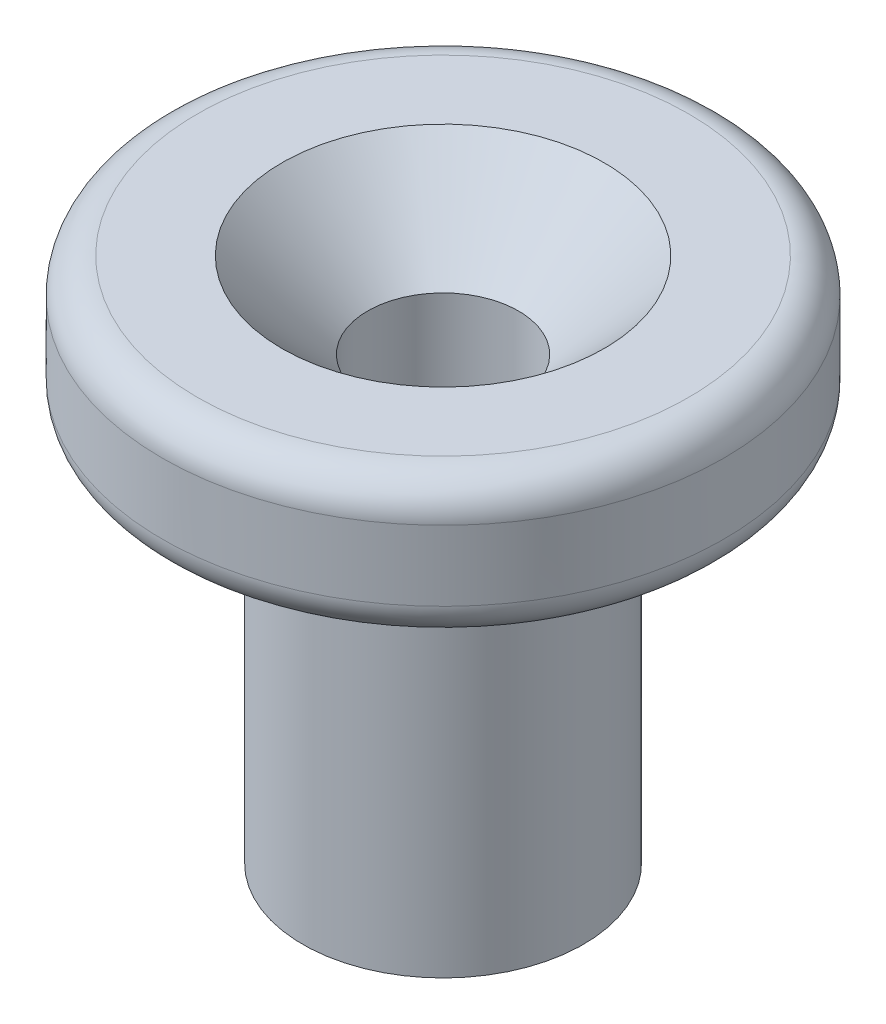
ISO-10303-21;
HEADER;
FILE_DESCRIPTION(('STEP AP214'),'2;1');
FILE_NAME('part.step','',(''),(''),'','','');
FILE_SCHEMA(('AUTOMOTIVE_DESIGN { 1 0 10303 214 1 1 1 1 }'));
ENDSEC;
DATA;
#1=APPLICATION_CONTEXT('core data for automotive mechanical design processes');
#2=APPLICATION_PROTOCOL_DEFINITION('international standard','automotive_design',2000,#1);
#3=PRODUCT_CONTEXT('',#1,'mechanical');
#4=PRODUCT('Part','Part','',(#3));
#5=PRODUCT_RELATED_PRODUCT_CATEGORY('part','',(#4));
#6=PRODUCT_DEFINITION_FORMATION('','',#4);
#7=PRODUCT_DEFINITION_CONTEXT('part definition',#1,'design');
#8=PRODUCT_DEFINITION('design','',#6,#7);
#9=PRODUCT_DEFINITION_SHAPE('','',#8);
#10=(LENGTH_UNIT() NAMED_UNIT(*) SI_UNIT(.MILLI.,.METRE.));
#11=(NAMED_UNIT(*) PLANE_ANGLE_UNIT() SI_UNIT($,.RADIAN.));
#12=(NAMED_UNIT(*) SI_UNIT($,.STERADIAN.) SOLID_ANGLE_UNIT());
#13=UNCERTAINTY_MEASURE_WITH_UNIT(LENGTH_MEASURE(1.E-05),#10,'distance_accuracy_value','');
#14=(GEOMETRIC_REPRESENTATION_CONTEXT(3) GLOBAL_UNCERTAINTY_ASSIGNED_CONTEXT((#13)) GLOBAL_UNIT_ASSIGNED_CONTEXT((#10,
#11,#12)) REPRESENTATION_CONTEXT('',''));
#15=CARTESIAN_POINT('',(0.,0.,0.));
#16=DIRECTION('',(0.,0.,1.));
#17=DIRECTION('',(1.,0.,0.));
#18=AXIS2_PLACEMENT_3D('',#15,#16,#17);
#19=CARTESIAN_POINT('',(0.,15.,0.));
#20=DIRECTION('',(0.,1.,0.));
#21=DIRECTION('',(0.,0.,1.));
#22=AXIS2_PLACEMENT_3D('',#19,#20,#21);
#23=PLANE('',#22);
#24=CARTESIAN_POINT('',(0.,15.,0.));
#25=DIRECTION('',(0.,1.,0.));
#26=DIRECTION('',(0.,0.,1.));
#27=AXIS2_PLACEMENT_3D('',#24,#25,#26);
#28=CIRCLE('',#27,4.59);
#29=CARTESIAN_POINT('',(0.,15.,4.59));
#30=VERTEX_POINT('',#29);
#31=EDGE_CURVE('E67',#30,#30,#28,.T.);
#32=ORIENTED_EDGE('',*,*,#31,.F.);
#33=EDGE_LOOP('',(#32));
#34=FACE_BOUND('',#33,.T.);
#35=CARTESIAN_POINT('',(0.,15.,0.));
#36=DIRECTION('',(0.,1.,0.));
#37=DIRECTION('',(0.,0.,1.));
#38=AXIS2_PLACEMENT_3D('',#35,#36,#37);
#39=CIRCLE('',#38,7.);
#40=CARTESIAN_POINT('',(0.,15.,7.));
#41=VERTEX_POINT('',#40);
#42=EDGE_CURVE('E39',#41,#41,#39,.T.);
#43=ORIENTED_EDGE('',*,*,#42,.T.);
#44=EDGE_LOOP('',(#43));
#45=FACE_BOUND('',#44,.T.);
#46=ADVANCED_FACE('F32',(#34,#45),#23,.T.);
#47=CARTESIAN_POINT('',(0.,0.,0.));
#48=DIRECTION('',(0.,-1.,0.));
#49=DIRECTION('',(0.,0.,-1.));
#50=AXIS2_PLACEMENT_3D('',#47,#48,#49);
#51=CYLINDRICAL_SURFACE('',#50,8.);
#52=CARTESIAN_POINT('',(0.,12.,0.));
#53=DIRECTION('',(0.,-1.,0.));
#54=DIRECTION('',(0.,0.,-1.));
#55=AXIS2_PLACEMENT_3D('',#52,#53,#54);
#56=CIRCLE('',#55,8.);
#57=CARTESIAN_POINT('',(0.,12.,-8.));
#58=VERTEX_POINT('',#57);
#59=EDGE_CURVE('E43',#58,#58,#56,.F.);
#60=ORIENTED_EDGE('',*,*,#59,.T.);
#61=EDGE_LOOP('',(#60));
#62=FACE_BOUND('',#61,.T.);
#63=CARTESIAN_POINT('',(0.,14.,0.));
#64=DIRECTION('',(0.,1.,0.));
#65=DIRECTION('',(0.,0.,1.));
#66=AXIS2_PLACEMENT_3D('',#63,#64,#65);
#67=CIRCLE('',#66,8.);
#68=CARTESIAN_POINT('',(0.,14.,8.));
#69=VERTEX_POINT('',#68);
#70=EDGE_CURVE('E47',#69,#69,#67,.F.);
#71=ORIENTED_EDGE('',*,*,#70,.T.);
#72=EDGE_LOOP('',(#71));
#73=FACE_BOUND('',#72,.T.);
#74=ADVANCED_FACE('F74',(#62,#73),#51,.T.);
#75=CARTESIAN_POINT('',(8.,11.,0.));
#76=DIRECTION('',(0.,-1.,0.));
#77=DIRECTION('',(0.,0.,-1.));
#78=AXIS2_PLACEMENT_3D('',#75,#76,#77);
#79=PLANE('',#78);
#80=CARTESIAN_POINT('',(0.,11.,0.));
#81=DIRECTION('',(0.,-1.,0.));
#82=DIRECTION('',(0.,0.,-1.));
#83=AXIS2_PLACEMENT_3D('',#80,#81,#82);
#84=CIRCLE('',#83,7.);
#85=CARTESIAN_POINT('',(0.,11.,-7.));
#86=VERTEX_POINT('',#85);
#87=EDGE_CURVE('E52',#86,#86,#84,.T.);
#88=ORIENTED_EDGE('',*,*,#87,.T.);
#89=EDGE_LOOP('',(#88));
#90=FACE_BOUND('',#89,.T.);
#91=CARTESIAN_POINT('',(0.,11.,0.));
#92=DIRECTION('',(0.,-1.,0.));
#93=DIRECTION('',(0.,0.,-1.));
#94=AXIS2_PLACEMENT_3D('',#91,#92,#93);
#95=CIRCLE('',#94,5.);
#96=CARTESIAN_POINT('',(0.,11.,-5.));
#97=VERTEX_POINT('',#96);
#98=EDGE_CURVE('E55',#97,#97,#95,.F.);
#99=ORIENTED_EDGE('',*,*,#98,.T.);
#100=EDGE_LOOP('',(#99));
#101=FACE_BOUND('',#100,.T.);
#102=ADVANCED_FACE('F79',(#90,#101),#79,.T.);
#103=CARTESIAN_POINT('',(0.,0.,0.));
#104=DIRECTION('',(0.,-1.,0.));
#105=DIRECTION('',(0.,0.,-1.));
#106=AXIS2_PLACEMENT_3D('',#103,#104,#105);
#107=CYLINDRICAL_SURFACE('',#106,4.);
#108=CARTESIAN_POINT('',(0.,10.,0.));
#109=DIRECTION('',(0.,-1.,0.));
#110=DIRECTION('',(0.,0.,-1.));
#111=AXIS2_PLACEMENT_3D('',#108,#109,#110);
#112=CIRCLE('',#111,4.);
#113=CARTESIAN_POINT('',(0.,10.,-4.));
#114=VERTEX_POINT('',#113);
#115=EDGE_CURVE('E10',#114,#114,#112,.T.);
#116=ORIENTED_EDGE('',*,*,#115,.T.);
#117=EDGE_LOOP('',(#116));
#118=FACE_BOUND('',#117,.T.);
#119=CARTESIAN_POINT('',(0.,0.,0.));
#120=DIRECTION('',(0.,-1.,0.));
#121=DIRECTION('',(0.,0.,-1.));
#122=AXIS2_PLACEMENT_3D('',#119,#120,#121);
#123=CIRCLE('',#122,4.);
#124=CARTESIAN_POINT('',(0.,0.,-4.));
#125=VERTEX_POINT('',#124);
#126=EDGE_CURVE('E58',#125,#125,#123,.T.);
#127=ORIENTED_EDGE('',*,*,#126,.F.);
#128=EDGE_LOOP('',(#127));
#129=FACE_BOUND('',#128,.T.);
#130=ADVANCED_FACE('F108',(#118,#129),#107,.T.);
#131=CARTESIAN_POINT('',(4.,0.,0.));
#132=DIRECTION('',(0.,-1.,0.));
#133=DIRECTION('',(0.,0.,-1.));
#134=AXIS2_PLACEMENT_3D('',#131,#132,#133);
#135=PLANE('',#134);
#136=CARTESIAN_POINT('',(0.,0.,0.));
#137=DIRECTION('',(0.,1.,0.));
#138=DIRECTION('',(0.,0.,1.));
#139=AXIS2_PLACEMENT_3D('',#136,#137,#138);
#140=CIRCLE('',#139,2.15);
#141=CARTESIAN_POINT('',(0.,0.,2.15));
#142=VERTEX_POINT('',#141);
#143=EDGE_CURVE('E61',#142,#142,#140,.T.);
#144=ORIENTED_EDGE('',*,*,#143,.T.);
#145=EDGE_LOOP('',(#144));
#146=FACE_BOUND('',#145,.T.);
#147=ORIENTED_EDGE('',*,*,#126,.T.);
#148=EDGE_LOOP('',(#147));
#149=FACE_BOUND('',#148,.T.);
#150=ADVANCED_FACE('F87',(#146,#149),#135,.T.);
#151=CARTESIAN_POINT('',(0.,12.,0.));
#152=DIRECTION('',(0.,-1.,0.));
#153=DIRECTION('',(0.,0.,-1.));
#154=AXIS2_PLACEMENT_3D('',#151,#152,#153);
#155=TOROIDAL_SURFACE('',#154,7.,1.);
#156=ORIENTED_EDGE('',*,*,#59,.F.);
#157=EDGE_LOOP('',(#156));
#158=FACE_BOUND('',#157,.T.);
#159=ORIENTED_EDGE('',*,*,#87,.F.);
#160=EDGE_LOOP('',(#159));
#161=FACE_BOUND('',#160,.T.);
#162=ADVANCED_FACE('F84',(#158,#161),#155,.T.);
#163=CARTESIAN_POINT('',(0.,14.,0.));
#164=DIRECTION('',(0.,1.,0.));
#165=DIRECTION('',(0.,0.,1.));
#166=AXIS2_PLACEMENT_3D('',#163,#164,#165);
#167=TOROIDAL_SURFACE('',#166,7.,1.);
#168=ORIENTED_EDGE('',*,*,#42,.F.);
#169=EDGE_LOOP('',(#168));
#170=FACE_BOUND('',#169,.T.);
#171=ORIENTED_EDGE('',*,*,#70,.F.);
#172=EDGE_LOOP('',(#171));
#173=FACE_BOUND('',#172,.T.);
#174=ADVANCED_FACE('F86',(#170,#173),#167,.T.);
#175=CARTESIAN_POINT('',(0.,10.,0.));
#176=DIRECTION('',(0.,-1.,0.));
#177=DIRECTION('',(0.,0.,-1.));
#178=AXIS2_PLACEMENT_3D('',#175,#176,#177);
#179=TOROIDAL_SURFACE('',#178,5.,1.);
#180=ORIENTED_EDGE('',*,*,#98,.F.);
#181=EDGE_LOOP('',(#180));
#182=FACE_BOUND('',#181,.T.);
#183=ORIENTED_EDGE('',*,*,#115,.F.);
#184=EDGE_LOOP('',(#183));
#185=FACE_BOUND('',#184,.T.);
#186=ADVANCED_FACE('F34',(#182,#185),#179,.F.);
#187=CARTESIAN_POINT('',(0.,15.,0.));
#188=DIRECTION('',(0.,1.,0.));
#189=DIRECTION('',(0.,0.,1.));
#190=AXIS2_PLACEMENT_3D('',#187,#188,#189);
#191=CYLINDRICAL_SURFACE('',#190,2.15);
#192=ORIENTED_EDGE('',*,*,#143,.F.);
#193=EDGE_LOOP('',(#192));
#194=FACE_BOUND('',#193,.T.);
#195=CARTESIAN_POINT('',(0.,12.56,0.));
#196=DIRECTION('',(0.,1.,0.));
#197=DIRECTION('',(0.,0.,1.));
#198=AXIS2_PLACEMENT_3D('',#195,#196,#197);
#199=CIRCLE('',#198,2.15);
#200=CARTESIAN_POINT('',(0.,12.56,2.15));
#201=VERTEX_POINT('',#200);
#202=EDGE_CURVE('E64',#201,#201,#199,.T.);
#203=ORIENTED_EDGE('',*,*,#202,.T.);
#204=EDGE_LOOP('',(#203));
#205=FACE_BOUND('',#204,.T.);
#206=ADVANCED_FACE('F94',(#194,#205),#191,.F.);
#207=CARTESIAN_POINT('',(0.,15.,0.));
#208=DIRECTION('',(0.,1.,0.));
#209=DIRECTION('',(0.,0.,1.));
#210=AXIS2_PLACEMENT_3D('',#207,#208,#209);
#211=CONICAL_SURFACE('',#210,4.59,0.785398163397448);
#212=ORIENTED_EDGE('',*,*,#202,.F.);
#213=EDGE_LOOP('',(#212));
#214=FACE_BOUND('',#213,.T.);
#215=ORIENTED_EDGE('',*,*,#31,.T.);
#216=EDGE_LOOP('',(#215));
#217=FACE_BOUND('',#216,.T.);
#218=ADVANCED_FACE('F71',(#214,#217),#211,.F.);
#219=CLOSED_SHELL('',(#46,#74,#102,#130,#150,#162,#174,#186,#206,#218));
#220=MANIFOLD_SOLID_BREP('B2',#219);
#221=ADVANCED_BREP_SHAPE_REPRESENTATION('',(#18,#220),#14);
#222=SHAPE_DEFINITION_REPRESENTATION(#9,#221);
ENDSEC;
END-ISO-10303-21;
